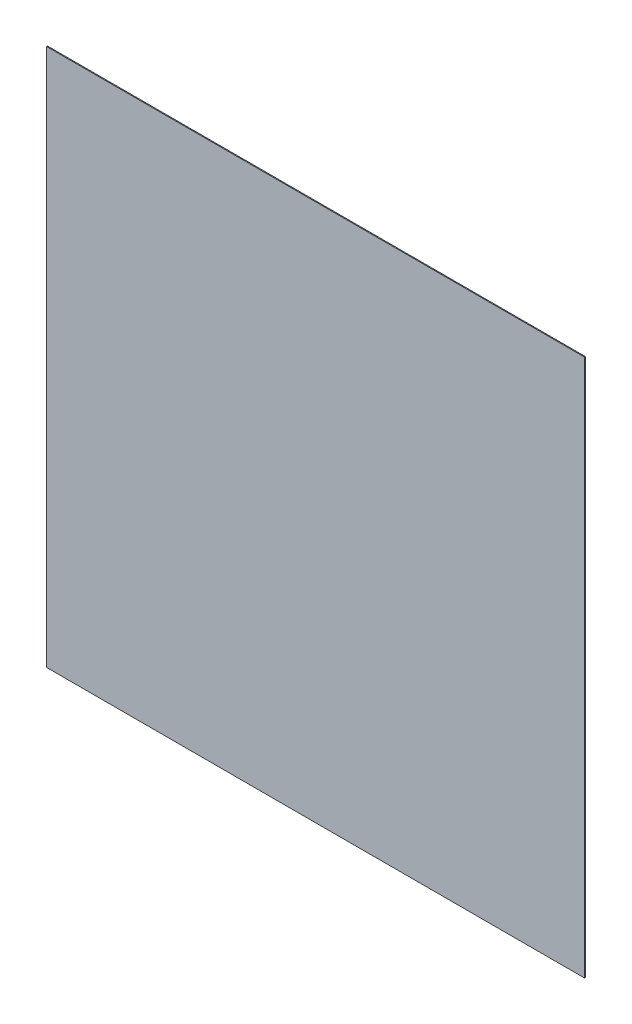
ISO-10303-21;
HEADER;
FILE_DESCRIPTION(('STEP AP214'),'2;1');
FILE_NAME('part.step','',(''),(''),'','','');
FILE_SCHEMA(('AUTOMOTIVE_DESIGN { 1 0 10303 214 1 1 1 1 }'));
ENDSEC;
DATA;
#1=APPLICATION_CONTEXT('core data for automotive mechanical design processes');
#2=APPLICATION_PROTOCOL_DEFINITION('international standard','automotive_design',2000,#1);
#3=PRODUCT_CONTEXT('',#1,'mechanical');
#4=PRODUCT('Part','Part','',(#3));
#5=PRODUCT_RELATED_PRODUCT_CATEGORY('part','',(#4));
#6=PRODUCT_DEFINITION_FORMATION('','',#4);
#7=PRODUCT_DEFINITION_CONTEXT('part definition',#1,'design');
#8=PRODUCT_DEFINITION('design','',#6,#7);
#9=PRODUCT_DEFINITION_SHAPE('','',#8);
#10=(LENGTH_UNIT() NAMED_UNIT(*) SI_UNIT(.MILLI.,.METRE.));
#11=(NAMED_UNIT(*) PLANE_ANGLE_UNIT() SI_UNIT($,.RADIAN.));
#12=(NAMED_UNIT(*) SI_UNIT($,.STERADIAN.) SOLID_ANGLE_UNIT());
#13=UNCERTAINTY_MEASURE_WITH_UNIT(LENGTH_MEASURE(1.E-05),#10,'distance_accuracy_value','');
#14=(GEOMETRIC_REPRESENTATION_CONTEXT(3) GLOBAL_UNCERTAINTY_ASSIGNED_CONTEXT((#13)) GLOBAL_UNIT_ASSIGNED_CONTEXT((#10,
#11,#12)) REPRESENTATION_CONTEXT('',''));
#15=CARTESIAN_POINT('',(0.,0.,0.));
#16=DIRECTION('',(0.,0.,1.));
#17=DIRECTION('',(1.,0.,0.));
#18=AXIS2_PLACEMENT_3D('',#15,#16,#17);
#19=CARTESIAN_POINT('',(0.,0.,0.01));
#20=DIRECTION('',(0.,0.,1.));
#21=DIRECTION('',(1.,0.,0.));
#22=AXIS2_PLACEMENT_3D('',#19,#20,#21);
#23=PLANE('',#22);
#24=DIRECTION('',(1.,0.,0.));
#25=VECTOR('',#24,1.);
#26=CARTESIAN_POINT('',(6.,6.,0.01));
#27=LINE('',#26,#25);
#28=CARTESIAN_POINT('',(0.,6.,0.01));
#29=VERTEX_POINT('',#28);
#30=CARTESIAN_POINT('',(6.,6.,0.01));
#31=VERTEX_POINT('',#30);
#32=EDGE_CURVE('E68',#29,#31,#27,.T.);
#33=ORIENTED_EDGE('',*,*,#32,.F.);
#34=DIRECTION('',(0.,1.,0.));
#35=VECTOR('',#34,1.);
#36=CARTESIAN_POINT('',(0.,6.,0.01));
#37=LINE('',#36,#35);
#38=CARTESIAN_POINT('',(0.,0.,0.01));
#39=VERTEX_POINT('',#38);
#40=EDGE_CURVE('E20',#39,#29,#37,.T.);
#41=ORIENTED_EDGE('',*,*,#40,.F.);
#42=DIRECTION('',(1.,0.,0.));
#43=VECTOR('',#42,1.);
#44=CARTESIAN_POINT('',(0.,0.,0.01));
#45=LINE('',#44,#43);
#46=CARTESIAN_POINT('',(6.,0.,0.01));
#47=VERTEX_POINT('',#46);
#48=EDGE_CURVE('E58',#47,#39,#45,.F.);
#49=ORIENTED_EDGE('',*,*,#48,.F.);
#50=DIRECTION('',(0.,1.,0.));
#51=VECTOR('',#50,1.);
#52=CARTESIAN_POINT('',(6.,0.,0.01));
#53=LINE('',#52,#51);
#54=EDGE_CURVE('E53',#31,#47,#53,.F.);
#55=ORIENTED_EDGE('',*,*,#54,.F.);
#56=EDGE_LOOP('',(#33,#41,#49,#55));
#57=FACE_BOUND('',#56,.T.);
#58=ADVANCED_FACE('F17',(#57),#23,.T.);
#59=CARTESIAN_POINT('',(0.,6.,0.));
#60=DIRECTION('',(-1.,0.,0.));
#61=DIRECTION('',(0.,0.,1.));
#62=AXIS2_PLACEMENT_3D('',#59,#60,#61);
#63=PLANE('',#62);
#64=DIRECTION('',(0.,0.,1.));
#65=VECTOR('',#64,1.);
#66=CARTESIAN_POINT('',(0.,6.,0.));
#67=LINE('',#66,#65);
#68=CARTESIAN_POINT('',(0.,6.,0.));
#69=VERTEX_POINT('',#68);
#70=EDGE_CURVE('E79',#69,#29,#67,.T.);
#71=ORIENTED_EDGE('',*,*,#70,.F.);
#72=DIRECTION('',(0.,1.,0.));
#73=VECTOR('',#72,1.);
#74=CARTESIAN_POINT('',(0.,0.,0.));
#75=LINE('',#74,#73);
#76=CARTESIAN_POINT('',(0.,0.,0.));
#77=VERTEX_POINT('',#76);
#78=EDGE_CURVE('E74',#69,#77,#75,.F.);
#79=ORIENTED_EDGE('',*,*,#78,.T.);
#80=DIRECTION('',(0.,0.,-1.));
#81=VECTOR('',#80,1.);
#82=CARTESIAN_POINT('',(0.,0.,0.));
#83=LINE('',#82,#81);
#84=EDGE_CURVE('E63',#39,#77,#83,.T.);
#85=ORIENTED_EDGE('',*,*,#84,.F.);
#86=ORIENTED_EDGE('',*,*,#40,.T.);
#87=EDGE_LOOP('',(#71,#79,#85,#86));
#88=FACE_BOUND('',#87,.T.);
#89=ADVANCED_FACE('F73',(#88),#63,.T.);
#90=CARTESIAN_POINT('',(0.,0.,0.));
#91=DIRECTION('',(0.,-1.,0.));
#92=DIRECTION('',(0.,0.,-1.));
#93=AXIS2_PLACEMENT_3D('',#90,#91,#92);
#94=PLANE('',#93);
#95=ORIENTED_EDGE('',*,*,#84,.T.);
#96=DIRECTION('',(1.,0.,0.));
#97=VECTOR('',#96,1.);
#98=CARTESIAN_POINT('',(0.,0.,0.));
#99=LINE('',#98,#97);
#100=CARTESIAN_POINT('',(6.,0.,0.));
#101=VERTEX_POINT('',#100);
#102=EDGE_CURVE('E84',#77,#101,#99,.T.);
#103=ORIENTED_EDGE('',*,*,#102,.T.);
#104=DIRECTION('',(0.,0.,-1.));
#105=VECTOR('',#104,1.);
#106=CARTESIAN_POINT('',(6.,0.,0.));
#107=LINE('',#106,#105);
#108=EDGE_CURVE('E65',#47,#101,#107,.T.);
#109=ORIENTED_EDGE('',*,*,#108,.F.);
#110=ORIENTED_EDGE('',*,*,#48,.T.);
#111=EDGE_LOOP('',(#95,#103,#109,#110));
#112=FACE_BOUND('',#111,.T.);
#113=ADVANCED_FACE('F60',(#112),#94,.T.);
#114=CARTESIAN_POINT('',(6.,0.,0.));
#115=DIRECTION('',(1.,0.,0.));
#116=DIRECTION('',(0.,0.,-1.));
#117=AXIS2_PLACEMENT_3D('',#114,#115,#116);
#118=PLANE('',#117);
#119=ORIENTED_EDGE('',*,*,#108,.T.);
#120=DIRECTION('',(0.,1.,0.));
#121=VECTOR('',#120,1.);
#122=CARTESIAN_POINT('',(6.,0.,0.));
#123=LINE('',#122,#121);
#124=CARTESIAN_POINT('',(6.,6.,0.));
#125=VERTEX_POINT('',#124);
#126=EDGE_CURVE('E26',#101,#125,#123,.T.);
#127=ORIENTED_EDGE('',*,*,#126,.T.);
#128=DIRECTION('',(0.,0.,1.));
#129=VECTOR('',#128,1.);
#130=CARTESIAN_POINT('',(6.,6.,0.));
#131=LINE('',#130,#129);
#132=EDGE_CURVE('E34',#31,#125,#131,.F.);
#133=ORIENTED_EDGE('',*,*,#132,.F.);
#134=ORIENTED_EDGE('',*,*,#54,.T.);
#135=EDGE_LOOP('',(#119,#127,#133,#134));
#136=FACE_BOUND('',#135,.T.);
#137=ADVANCED_FACE('F88',(#136),#118,.T.);
#138=CARTESIAN_POINT('',(6.,6.,0.));
#139=DIRECTION('',(0.,1.,0.));
#140=DIRECTION('',(0.,0.,1.));
#141=AXIS2_PLACEMENT_3D('',#138,#139,#140);
#142=PLANE('',#141);
#143=ORIENTED_EDGE('',*,*,#132,.T.);
#144=DIRECTION('',(1.,0.,0.));
#145=VECTOR('',#144,1.);
#146=CARTESIAN_POINT('',(0.,6.,0.));
#147=LINE('',#146,#145);
#148=EDGE_CURVE('E11',#125,#69,#147,.F.);
#149=ORIENTED_EDGE('',*,*,#148,.T.);
#150=ORIENTED_EDGE('',*,*,#70,.T.);
#151=ORIENTED_EDGE('',*,*,#32,.T.);
#152=EDGE_LOOP('',(#143,#149,#150,#151));
#153=FACE_BOUND('',#152,.T.);
#154=ADVANCED_FACE('F91',(#153),#142,.T.);
#155=CARTESIAN_POINT('',(0.,0.,0.));
#156=DIRECTION('',(0.,0.,1.));
#157=DIRECTION('',(1.,0.,0.));
#158=AXIS2_PLACEMENT_3D('',#155,#156,#157);
#159=PLANE('',#158);
#160=ORIENTED_EDGE('',*,*,#126,.F.);
#161=ORIENTED_EDGE('',*,*,#102,.F.);
#162=ORIENTED_EDGE('',*,*,#78,.F.);
#163=ORIENTED_EDGE('',*,*,#148,.F.);
#164=EDGE_LOOP('',(#160,#161,#162,#163));
#165=FACE_BOUND('',#164,.T.);
#166=ADVANCED_FACE('F90',(#165),#159,.F.);
#167=CLOSED_SHELL('',(#58,#89,#113,#137,#154,#166));
#168=MANIFOLD_SOLID_BREP('B1',#167);
#169=ADVANCED_BREP_SHAPE_REPRESENTATION('',(#18,#168),#14);
#170=SHAPE_DEFINITION_REPRESENTATION(#9,#169);
ENDSEC;
END-ISO-10303-21;
